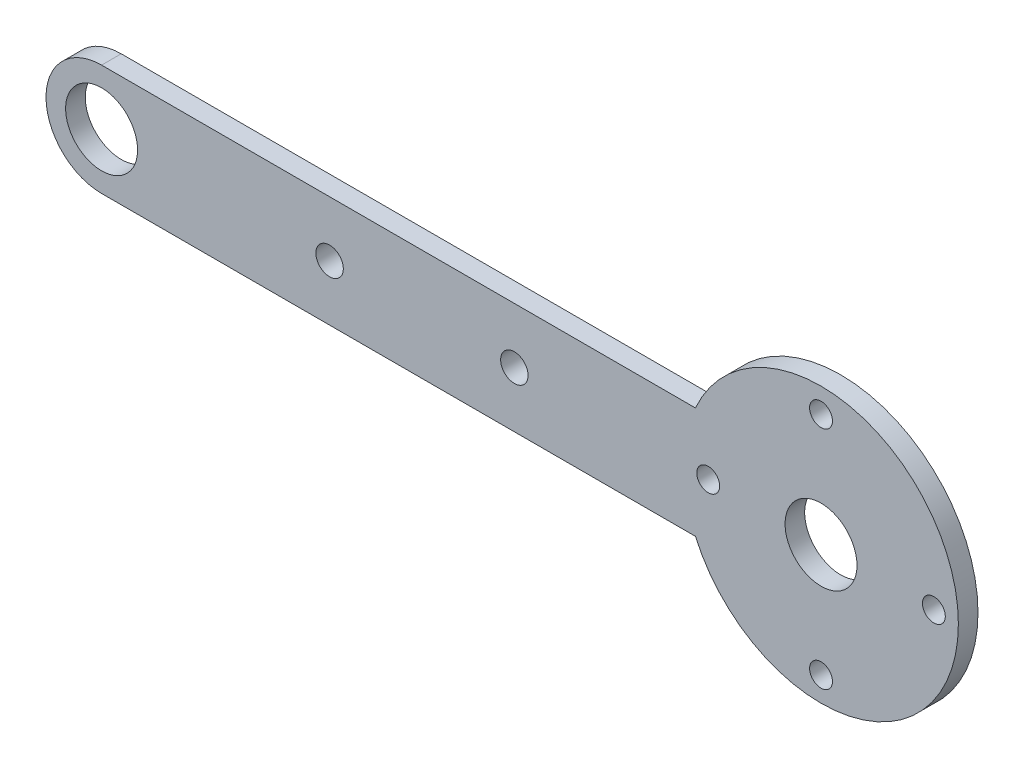
ISO-10303-21;
HEADER;
FILE_DESCRIPTION(('STEP AP214'),'2;1');
FILE_NAME('part.step','',(''),(''),'','','');
FILE_SCHEMA(('AUTOMOTIVE_DESIGN { 1 0 10303 214 1 1 1 1 }'));
ENDSEC;
DATA;
#1=APPLICATION_CONTEXT('core data for automotive mechanical design processes');
#2=APPLICATION_PROTOCOL_DEFINITION('international standard','automotive_design',2000,#1);
#3=PRODUCT_CONTEXT('',#1,'mechanical');
#4=PRODUCT('Part','Part','',(#3));
#5=PRODUCT_RELATED_PRODUCT_CATEGORY('part','',(#4));
#6=PRODUCT_DEFINITION_FORMATION('','',#4);
#7=PRODUCT_DEFINITION_CONTEXT('part definition',#1,'design');
#8=PRODUCT_DEFINITION('design','',#6,#7);
#9=PRODUCT_DEFINITION_SHAPE('','',#8);
#10=(LENGTH_UNIT() NAMED_UNIT(*) SI_UNIT(.MILLI.,.METRE.));
#11=(NAMED_UNIT(*) PLANE_ANGLE_UNIT() SI_UNIT($,.RADIAN.));
#12=(NAMED_UNIT(*) SI_UNIT($,.STERADIAN.) SOLID_ANGLE_UNIT());
#13=UNCERTAINTY_MEASURE_WITH_UNIT(LENGTH_MEASURE(1.E-05),#10,'distance_accuracy_value','');
#14=(GEOMETRIC_REPRESENTATION_CONTEXT(3) GLOBAL_UNCERTAINTY_ASSIGNED_CONTEXT((#13)) GLOBAL_UNIT_ASSIGNED_CONTEXT((#10,
#11,#12)) REPRESENTATION_CONTEXT('',''));
#15=CARTESIAN_POINT('',(0.,0.,0.));
#16=DIRECTION('',(0.,0.,1.));
#17=DIRECTION('',(1.,0.,0.));
#18=AXIS2_PLACEMENT_3D('',#15,#16,#17);
#19=CARTESIAN_POINT('',(-110.,0.,3.));
#20=DIRECTION('',(0.,0.,1.));
#21=DIRECTION('',(1.,0.,0.));
#22=AXIS2_PLACEMENT_3D('',#19,#20,#21);
#23=PLANE('',#22);
#24=CARTESIAN_POINT('',(-75.14,0.,3.));
#25=DIRECTION('',(0.,0.,1.));
#26=DIRECTION('',(1.,0.,0.));
#27=AXIS2_PLACEMENT_3D('',#24,#25,#26);
#28=CIRCLE('',#27,2.1);
#29=CARTESIAN_POINT('',(-73.04,0.,3.));
#30=VERTEX_POINT('',#29);
#31=EDGE_CURVE('E146',#30,#30,#28,.T.);
#32=ORIENTED_EDGE('',*,*,#31,.F.);
#33=EDGE_LOOP('',(#32));
#34=FACE_BOUND('',#33,.T.);
#35=CARTESIAN_POINT('',(0.,-17.25,3.));
#36=DIRECTION('',(0.,0.,1.));
#37=DIRECTION('',(1.,0.,0.));
#38=AXIS2_PLACEMENT_3D('',#35,#36,#37);
#39=CIRCLE('',#38,1.75);
#40=CARTESIAN_POINT('',(1.75,-17.25,3.));
#41=VERTEX_POINT('',#40);
#42=EDGE_CURVE('E134',#41,#41,#39,.T.);
#43=ORIENTED_EDGE('',*,*,#42,.F.);
#44=EDGE_LOOP('',(#43));
#45=FACE_BOUND('',#44,.T.);
#46=CARTESIAN_POINT('',(0.,17.25,3.));
#47=DIRECTION('',(0.,0.,1.));
#48=DIRECTION('',(1.,0.,0.));
#49=AXIS2_PLACEMENT_3D('',#46,#47,#48);
#50=CIRCLE('',#49,1.75);
#51=CARTESIAN_POINT('',(1.75,17.25,3.));
#52=VERTEX_POINT('',#51);
#53=EDGE_CURVE('E122',#52,#52,#50,.T.);
#54=ORIENTED_EDGE('',*,*,#53,.F.);
#55=EDGE_LOOP('',(#54));
#56=FACE_BOUND('',#55,.T.);
#57=CARTESIAN_POINT('',(-110.,0.,3.));
#58=DIRECTION('',(0.,0.,1.));
#59=DIRECTION('',(1.,0.,0.));
#60=AXIS2_PLACEMENT_3D('',#57,#58,#59);
#61=CIRCLE('',#60,5.49999999999999);
#62=CARTESIAN_POINT('',(-104.5,0.,3.));
#63=VERTEX_POINT('',#62);
#64=EDGE_CURVE('E101',#63,#63,#61,.T.);
#65=ORIENTED_EDGE('',*,*,#64,.F.);
#66=EDGE_LOOP('',(#65));
#67=FACE_BOUND('',#66,.T.);
#68=CARTESIAN_POINT('',(-110.,0.,3.));
#69=DIRECTION('',(0.,0.,1.));
#70=DIRECTION('',(1.,0.,0.));
#71=AXIS2_PLACEMENT_3D('',#68,#69,#70);
#72=CIRCLE('',#71,8.5);
#73=CARTESIAN_POINT('',(-110.,8.5,3.));
#74=VERTEX_POINT('',#73);
#75=CARTESIAN_POINT('',(-110.,-8.5,3.));
#76=VERTEX_POINT('',#75);
#77=EDGE_CURVE('E86',#74,#76,#72,.T.);
#78=ORIENTED_EDGE('',*,*,#77,.T.);
#79=DIRECTION('',(1.,0.,0.));
#80=VECTOR('',#79,1.);
#81=CARTESIAN_POINT('',(-110.,-8.5,3.));
#82=LINE('',#81,#80);
#83=CARTESIAN_POINT('',(-19.2028643696715,-8.5,3.));
#84=VERTEX_POINT('',#83);
#85=EDGE_CURVE('E81',#76,#84,#82,.T.);
#86=ORIENTED_EDGE('',*,*,#85,.T.);
#87=CARTESIAN_POINT('',(0.,0.,3.));
#88=DIRECTION('',(0.,0.,1.));
#89=DIRECTION('',(1.,0.,0.));
#90=AXIS2_PLACEMENT_3D('',#87,#88,#89);
#91=CIRCLE('',#90,21.);
#92=CARTESIAN_POINT('',(-19.2028643696715,8.5,3.));
#93=VERTEX_POINT('',#92);
#94=EDGE_CURVE('E84',#84,#93,#91,.T.);
#95=ORIENTED_EDGE('',*,*,#94,.T.);
#96=DIRECTION('',(-1.,0.,0.));
#97=VECTOR('',#96,1.);
#98=CARTESIAN_POINT('',(-110.,8.5,3.));
#99=LINE('',#98,#97);
#100=EDGE_CURVE('E51',#93,#74,#99,.T.);
#101=ORIENTED_EDGE('',*,*,#100,.T.);
#102=EDGE_LOOP('',(#78,#86,#95,#101));
#103=FACE_BOUND('',#102,.T.);
#104=CARTESIAN_POINT('',(0.,0.,3.));
#105=DIRECTION('',(0.,0.,1.));
#106=DIRECTION('',(1.,0.,0.));
#107=AXIS2_PLACEMENT_3D('',#104,#105,#106);
#108=CIRCLE('',#107,5.5);
#109=CARTESIAN_POINT('',(5.5,0.,3.));
#110=VERTEX_POINT('',#109);
#111=EDGE_CURVE('E116',#110,#110,#108,.T.);
#112=ORIENTED_EDGE('',*,*,#111,.F.);
#113=EDGE_LOOP('',(#112));
#114=FACE_BOUND('',#113,.T.);
#115=CARTESIAN_POINT('',(17.25,0.,3.));
#116=DIRECTION('',(0.,0.,1.));
#117=DIRECTION('',(1.,0.,0.));
#118=AXIS2_PLACEMENT_3D('',#115,#116,#117);
#119=CIRCLE('',#118,1.75);
#120=CARTESIAN_POINT('',(19.,0.,3.));
#121=VERTEX_POINT('',#120);
#122=EDGE_CURVE('E128',#121,#121,#119,.T.);
#123=ORIENTED_EDGE('',*,*,#122,.F.);
#124=EDGE_LOOP('',(#123));
#125=FACE_BOUND('',#124,.T.);
#126=CARTESIAN_POINT('',(-17.25,0.,3.));
#127=DIRECTION('',(0.,0.,1.));
#128=DIRECTION('',(1.,0.,0.));
#129=AXIS2_PLACEMENT_3D('',#126,#127,#128);
#130=CIRCLE('',#129,1.75);
#131=CARTESIAN_POINT('',(-15.5,0.,3.));
#132=VERTEX_POINT('',#131);
#133=EDGE_CURVE('E140',#132,#132,#130,.T.);
#134=ORIENTED_EDGE('',*,*,#133,.F.);
#135=EDGE_LOOP('',(#134));
#136=FACE_BOUND('',#135,.T.);
#137=CARTESIAN_POINT('',(-46.89,0.,3.));
#138=DIRECTION('',(0.,0.,1.));
#139=DIRECTION('',(1.,0.,0.));
#140=AXIS2_PLACEMENT_3D('',#137,#138,#139);
#141=CIRCLE('',#140,2.1);
#142=CARTESIAN_POINT('',(-44.79,0.,3.));
#143=VERTEX_POINT('',#142);
#144=EDGE_CURVE('E152',#143,#143,#141,.T.);
#145=ORIENTED_EDGE('',*,*,#144,.F.);
#146=EDGE_LOOP('',(#145));
#147=FACE_BOUND('',#146,.T.);
#148=ADVANCED_FACE('F34',(#34,#45,#56,#67,#103,#114,#125,#136,#147),#23,.T.);
#149=CARTESIAN_POINT('',(-110.,0.,0.));
#150=DIRECTION('',(0.,0.,1.));
#151=DIRECTION('',(1.,0.,0.));
#152=AXIS2_PLACEMENT_3D('',#149,#150,#151);
#153=PLANE('',#152);
#154=CARTESIAN_POINT('',(-110.,0.,0.));
#155=DIRECTION('',(0.,0.,1.));
#156=DIRECTION('',(1.,0.,0.));
#157=AXIS2_PLACEMENT_3D('',#154,#155,#156);
#158=CIRCLE('',#157,8.5);
#159=CARTESIAN_POINT('',(-110.,8.5,0.));
#160=VERTEX_POINT('',#159);
#161=CARTESIAN_POINT('',(-110.,-8.5,0.));
#162=VERTEX_POINT('',#161);
#163=EDGE_CURVE('E98',#160,#162,#158,.T.);
#164=ORIENTED_EDGE('',*,*,#163,.F.);
#165=DIRECTION('',(-1.,0.,0.));
#166=VECTOR('',#165,1.);
#167=CARTESIAN_POINT('',(-110.,8.5,0.));
#168=LINE('',#167,#166);
#169=CARTESIAN_POINT('',(-19.2028643696715,8.5,0.));
#170=VERTEX_POINT('',#169);
#171=EDGE_CURVE('E74',#170,#160,#168,.T.);
#172=ORIENTED_EDGE('',*,*,#171,.F.);
#173=CARTESIAN_POINT('',(0.,0.,0.));
#174=DIRECTION('',(0.,0.,1.));
#175=DIRECTION('',(1.,0.,0.));
#176=AXIS2_PLACEMENT_3D('',#173,#174,#175);
#177=CIRCLE('',#176,21.);
#178=CARTESIAN_POINT('',(-19.2028643696715,-8.5,0.));
#179=VERTEX_POINT('',#178);
#180=EDGE_CURVE('E68',#179,#170,#177,.T.);
#181=ORIENTED_EDGE('',*,*,#180,.F.);
#182=DIRECTION('',(1.,0.,0.));
#183=VECTOR('',#182,1.);
#184=CARTESIAN_POINT('',(-110.,-8.5,0.));
#185=LINE('',#184,#183);
#186=EDGE_CURVE('E90',#162,#179,#185,.T.);
#187=ORIENTED_EDGE('',*,*,#186,.F.);
#188=EDGE_LOOP('',(#164,#172,#181,#187));
#189=FACE_BOUND('',#188,.T.);
#190=CARTESIAN_POINT('',(-110.,0.,0.));
#191=DIRECTION('',(0.,0.,1.));
#192=DIRECTION('',(1.,0.,0.));
#193=AXIS2_PLACEMENT_3D('',#190,#191,#192);
#194=CIRCLE('',#193,5.49999999999999);
#195=CARTESIAN_POINT('',(-104.5,0.,0.));
#196=VERTEX_POINT('',#195);
#197=EDGE_CURVE('E113',#196,#196,#194,.T.);
#198=ORIENTED_EDGE('',*,*,#197,.T.);
#199=EDGE_LOOP('',(#198));
#200=FACE_BOUND('',#199,.T.);
#201=CARTESIAN_POINT('',(0.,0.,0.));
#202=DIRECTION('',(0.,0.,1.));
#203=DIRECTION('',(1.,0.,0.));
#204=AXIS2_PLACEMENT_3D('',#201,#202,#203);
#205=CIRCLE('',#204,5.5);
#206=CARTESIAN_POINT('',(5.5,0.,0.));
#207=VERTEX_POINT('',#206);
#208=EDGE_CURVE('E119',#207,#207,#205,.T.);
#209=ORIENTED_EDGE('',*,*,#208,.T.);
#210=EDGE_LOOP('',(#209));
#211=FACE_BOUND('',#210,.T.);
#212=CARTESIAN_POINT('',(0.,17.25,0.));
#213=DIRECTION('',(0.,0.,1.));
#214=DIRECTION('',(1.,0.,0.));
#215=AXIS2_PLACEMENT_3D('',#212,#213,#214);
#216=CIRCLE('',#215,1.75);
#217=CARTESIAN_POINT('',(1.75,17.25,0.));
#218=VERTEX_POINT('',#217);
#219=EDGE_CURVE('E125',#218,#218,#216,.T.);
#220=ORIENTED_EDGE('',*,*,#219,.T.);
#221=EDGE_LOOP('',(#220));
#222=FACE_BOUND('',#221,.T.);
#223=CARTESIAN_POINT('',(17.25,0.,0.));
#224=DIRECTION('',(0.,0.,1.));
#225=DIRECTION('',(1.,0.,0.));
#226=AXIS2_PLACEMENT_3D('',#223,#224,#225);
#227=CIRCLE('',#226,1.75);
#228=CARTESIAN_POINT('',(19.,0.,0.));
#229=VERTEX_POINT('',#228);
#230=EDGE_CURVE('E131',#229,#229,#227,.T.);
#231=ORIENTED_EDGE('',*,*,#230,.T.);
#232=EDGE_LOOP('',(#231));
#233=FACE_BOUND('',#232,.T.);
#234=CARTESIAN_POINT('',(0.,-17.25,0.));
#235=DIRECTION('',(0.,0.,1.));
#236=DIRECTION('',(1.,0.,0.));
#237=AXIS2_PLACEMENT_3D('',#234,#235,#236);
#238=CIRCLE('',#237,1.75);
#239=CARTESIAN_POINT('',(1.75,-17.25,0.));
#240=VERTEX_POINT('',#239);
#241=EDGE_CURVE('E137',#240,#240,#238,.T.);
#242=ORIENTED_EDGE('',*,*,#241,.T.);
#243=EDGE_LOOP('',(#242));
#244=FACE_BOUND('',#243,.T.);
#245=CARTESIAN_POINT('',(-17.25,0.,0.));
#246=DIRECTION('',(0.,0.,1.));
#247=DIRECTION('',(1.,0.,0.));
#248=AXIS2_PLACEMENT_3D('',#245,#246,#247);
#249=CIRCLE('',#248,1.75);
#250=CARTESIAN_POINT('',(-15.5,0.,0.));
#251=VERTEX_POINT('',#250);
#252=EDGE_CURVE('E143',#251,#251,#249,.T.);
#253=ORIENTED_EDGE('',*,*,#252,.T.);
#254=EDGE_LOOP('',(#253));
#255=FACE_BOUND('',#254,.T.);
#256=CARTESIAN_POINT('',(-75.14,0.,0.));
#257=DIRECTION('',(0.,0.,1.));
#258=DIRECTION('',(1.,0.,0.));
#259=AXIS2_PLACEMENT_3D('',#256,#257,#258);
#260=CIRCLE('',#259,2.1);
#261=CARTESIAN_POINT('',(-73.04,0.,0.));
#262=VERTEX_POINT('',#261);
#263=EDGE_CURVE('E149',#262,#262,#260,.T.);
#264=ORIENTED_EDGE('',*,*,#263,.T.);
#265=EDGE_LOOP('',(#264));
#266=FACE_BOUND('',#265,.T.);
#267=CARTESIAN_POINT('',(-46.89,0.,0.));
#268=DIRECTION('',(0.,0.,1.));
#269=DIRECTION('',(1.,0.,0.));
#270=AXIS2_PLACEMENT_3D('',#267,#268,#269);
#271=CIRCLE('',#270,2.1);
#272=CARTESIAN_POINT('',(-44.79,0.,0.));
#273=VERTEX_POINT('',#272);
#274=EDGE_CURVE('E155',#273,#273,#271,.T.);
#275=ORIENTED_EDGE('',*,*,#274,.T.);
#276=EDGE_LOOP('',(#275));
#277=FACE_BOUND('',#276,.T.);
#278=ADVANCED_FACE('F109',(#189,#200,#211,#222,#233,#244,#255,#266,#277),#153,.F.);
#279=CARTESIAN_POINT('',(-110.,0.,3.));
#280=DIRECTION('',(0.,0.,-1.));
#281=DIRECTION('',(-1.,0.,0.));
#282=AXIS2_PLACEMENT_3D('',#279,#280,#281);
#283=CYLINDRICAL_SURFACE('',#282,8.5);
#284=ORIENTED_EDGE('',*,*,#163,.T.);
#285=DIRECTION('',(0.,0.,-1.));
#286=VECTOR('',#285,1.);
#287=CARTESIAN_POINT('',(-110.,-8.5,3.));
#288=LINE('',#287,#286);
#289=EDGE_CURVE('E11',#76,#162,#288,.T.);
#290=ORIENTED_EDGE('',*,*,#289,.F.);
#291=ORIENTED_EDGE('',*,*,#77,.F.);
#292=DIRECTION('',(0.,0.,-1.));
#293=VECTOR('',#292,1.);
#294=CARTESIAN_POINT('',(-110.,8.5,3.));
#295=LINE('',#294,#293);
#296=EDGE_CURVE('E94',#74,#160,#295,.T.);
#297=ORIENTED_EDGE('',*,*,#296,.T.);
#298=EDGE_LOOP('',(#284,#290,#291,#297));
#299=FACE_BOUND('',#298,.T.);
#300=ADVANCED_FACE('F36',(#299),#283,.T.);
#301=CARTESIAN_POINT('',(-110.,-8.5,3.));
#302=DIRECTION('',(0.,1.,0.));
#303=DIRECTION('',(0.,0.,1.));
#304=AXIS2_PLACEMENT_3D('',#301,#302,#303);
#305=PLANE('',#304);
#306=ORIENTED_EDGE('',*,*,#186,.T.);
#307=DIRECTION('',(0.,0.,-1.));
#308=VECTOR('',#307,1.);
#309=CARTESIAN_POINT('',(-19.2028643696715,-8.5,3.));
#310=LINE('',#309,#308);
#311=EDGE_CURVE('E43',#84,#179,#310,.T.);
#312=ORIENTED_EDGE('',*,*,#311,.F.);
#313=ORIENTED_EDGE('',*,*,#85,.F.);
#314=ORIENTED_EDGE('',*,*,#289,.T.);
#315=EDGE_LOOP('',(#306,#312,#313,#314));
#316=FACE_BOUND('',#315,.T.);
#317=ADVANCED_FACE('F89',(#316),#305,.F.);
#318=CARTESIAN_POINT('',(0.,0.,3.));
#319=DIRECTION('',(0.,0.,-1.));
#320=DIRECTION('',(-1.,0.,0.));
#321=AXIS2_PLACEMENT_3D('',#318,#319,#320);
#322=CYLINDRICAL_SURFACE('',#321,21.);
#323=ORIENTED_EDGE('',*,*,#180,.T.);
#324=DIRECTION('',(0.,0.,-1.));
#325=VECTOR('',#324,1.);
#326=CARTESIAN_POINT('',(-19.2028643696715,8.5,3.));
#327=LINE('',#326,#325);
#328=EDGE_CURVE('E91',#93,#170,#327,.T.);
#329=ORIENTED_EDGE('',*,*,#328,.F.);
#330=ORIENTED_EDGE('',*,*,#94,.F.);
#331=ORIENTED_EDGE('',*,*,#311,.T.);
#332=EDGE_LOOP('',(#323,#329,#330,#331));
#333=FACE_BOUND('',#332,.T.);
#334=ADVANCED_FACE('F92',(#333),#322,.T.);
#335=CARTESIAN_POINT('',(-110.,8.5,3.));
#336=DIRECTION('',(0.,-1.,0.));
#337=DIRECTION('',(0.,0.,-1.));
#338=AXIS2_PLACEMENT_3D('',#335,#336,#337);
#339=PLANE('',#338);
#340=ORIENTED_EDGE('',*,*,#171,.T.);
#341=ORIENTED_EDGE('',*,*,#296,.F.);
#342=ORIENTED_EDGE('',*,*,#100,.F.);
#343=ORIENTED_EDGE('',*,*,#328,.T.);
#344=EDGE_LOOP('',(#340,#341,#342,#343));
#345=FACE_BOUND('',#344,.T.);
#346=ADVANCED_FACE('F106',(#345),#339,.F.);
#347=CARTESIAN_POINT('',(-110.,0.,3.));
#348=DIRECTION('',(0.,0.,-1.));
#349=DIRECTION('',(-1.,0.,0.));
#350=AXIS2_PLACEMENT_3D('',#347,#348,#349);
#351=CYLINDRICAL_SURFACE('',#350,5.49999999999999);
#352=ORIENTED_EDGE('',*,*,#64,.T.);
#353=EDGE_LOOP('',(#352));
#354=FACE_BOUND('',#353,.T.);
#355=ORIENTED_EDGE('',*,*,#197,.F.);
#356=EDGE_LOOP('',(#355));
#357=FACE_BOUND('',#356,.T.);
#358=ADVANCED_FACE('F174',(#354,#357),#351,.F.);
#359=CARTESIAN_POINT('',(0.,0.,3.));
#360=DIRECTION('',(0.,0.,-1.));
#361=DIRECTION('',(-1.,0.,0.));
#362=AXIS2_PLACEMENT_3D('',#359,#360,#361);
#363=CYLINDRICAL_SURFACE('',#362,5.5);
#364=ORIENTED_EDGE('',*,*,#111,.T.);
#365=EDGE_LOOP('',(#364));
#366=FACE_BOUND('',#365,.T.);
#367=ORIENTED_EDGE('',*,*,#208,.F.);
#368=EDGE_LOOP('',(#367));
#369=FACE_BOUND('',#368,.T.);
#370=ADVANCED_FACE('F220',(#366,#369),#363,.F.);
#371=CARTESIAN_POINT('',(0.,17.25,3.));
#372=DIRECTION('',(0.,0.,-1.));
#373=DIRECTION('',(-1.,0.,0.));
#374=AXIS2_PLACEMENT_3D('',#371,#372,#373);
#375=CYLINDRICAL_SURFACE('',#374,1.75);
#376=ORIENTED_EDGE('',*,*,#53,.T.);
#377=EDGE_LOOP('',(#376));
#378=FACE_BOUND('',#377,.T.);
#379=ORIENTED_EDGE('',*,*,#219,.F.);
#380=EDGE_LOOP('',(#379));
#381=FACE_BOUND('',#380,.T.);
#382=ADVANCED_FACE('F228',(#378,#381),#375,.F.);
#383=CARTESIAN_POINT('',(17.25,0.,3.));
#384=DIRECTION('',(0.,0.,-1.));
#385=DIRECTION('',(-1.,0.,0.));
#386=AXIS2_PLACEMENT_3D('',#383,#384,#385);
#387=CYLINDRICAL_SURFACE('',#386,1.75);
#388=ORIENTED_EDGE('',*,*,#122,.T.);
#389=EDGE_LOOP('',(#388));
#390=FACE_BOUND('',#389,.T.);
#391=ORIENTED_EDGE('',*,*,#230,.F.);
#392=EDGE_LOOP('',(#391));
#393=FACE_BOUND('',#392,.T.);
#394=ADVANCED_FACE('F236',(#390,#393),#387,.F.);
#395=CARTESIAN_POINT('',(0.,-17.25,3.));
#396=DIRECTION('',(0.,0.,-1.));
#397=DIRECTION('',(-1.,0.,0.));
#398=AXIS2_PLACEMENT_3D('',#395,#396,#397);
#399=CYLINDRICAL_SURFACE('',#398,1.75);
#400=ORIENTED_EDGE('',*,*,#42,.T.);
#401=EDGE_LOOP('',(#400));
#402=FACE_BOUND('',#401,.T.);
#403=ORIENTED_EDGE('',*,*,#241,.F.);
#404=EDGE_LOOP('',(#403));
#405=FACE_BOUND('',#404,.T.);
#406=ADVANCED_FACE('F245',(#402,#405),#399,.F.);
#407=CARTESIAN_POINT('',(-17.25,0.,3.));
#408=DIRECTION('',(0.,0.,-1.));
#409=DIRECTION('',(-1.,0.,0.));
#410=AXIS2_PLACEMENT_3D('',#407,#408,#409);
#411=CYLINDRICAL_SURFACE('',#410,1.75);
#412=ORIENTED_EDGE('',*,*,#133,.T.);
#413=EDGE_LOOP('',(#412));
#414=FACE_BOUND('',#413,.T.);
#415=ORIENTED_EDGE('',*,*,#252,.F.);
#416=EDGE_LOOP('',(#415));
#417=FACE_BOUND('',#416,.T.);
#418=ADVANCED_FACE('F254',(#414,#417),#411,.F.);
#419=CARTESIAN_POINT('',(-75.14,0.,3.));
#420=DIRECTION('',(0.,0.,-1.));
#421=DIRECTION('',(-1.,0.,0.));
#422=AXIS2_PLACEMENT_3D('',#419,#420,#421);
#423=CYLINDRICAL_SURFACE('',#422,2.1);
#424=ORIENTED_EDGE('',*,*,#31,.T.);
#425=EDGE_LOOP('',(#424));
#426=FACE_BOUND('',#425,.T.);
#427=ORIENTED_EDGE('',*,*,#263,.F.);
#428=EDGE_LOOP('',(#427));
#429=FACE_BOUND('',#428,.T.);
#430=ADVANCED_FACE('F263',(#426,#429),#423,.F.);
#431=CARTESIAN_POINT('',(-46.89,0.,3.));
#432=DIRECTION('',(0.,0.,-1.));
#433=DIRECTION('',(-1.,0.,0.));
#434=AXIS2_PLACEMENT_3D('',#431,#432,#433);
#435=CYLINDRICAL_SURFACE('',#434,2.1);
#436=ORIENTED_EDGE('',*,*,#144,.T.);
#437=EDGE_LOOP('',(#436));
#438=FACE_BOUND('',#437,.T.);
#439=ORIENTED_EDGE('',*,*,#274,.F.);
#440=EDGE_LOOP('',(#439));
#441=FACE_BOUND('',#440,.T.);
#442=ADVANCED_FACE('F161',(#438,#441),#435,.F.);
#443=CLOSED_SHELL('',(#148,#278,#300,#317,#334,#346,#358,#370,#382,#394,#406,#418,#430,#442));
#444=MANIFOLD_SOLID_BREP('B2',#443);
#445=ADVANCED_BREP_SHAPE_REPRESENTATION('',(#18,#444),#14);
#446=SHAPE_DEFINITION_REPRESENTATION(#9,#445);
ENDSEC;
END-ISO-10303-21;
